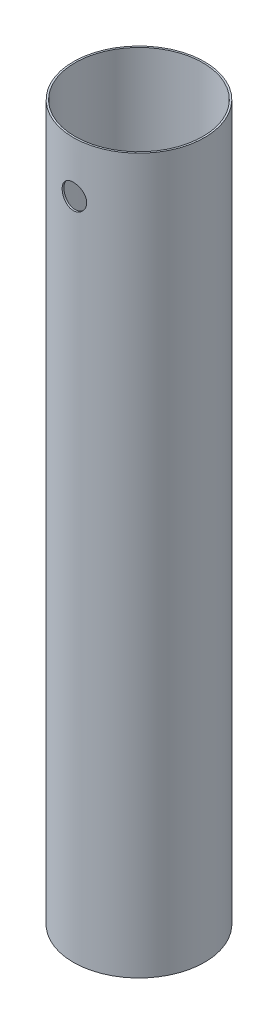
ISO-10303-21;
HEADER;
FILE_DESCRIPTION(('STEP AP214'),'2;1');
FILE_NAME('part.step','',(''),(''),'','','');
FILE_SCHEMA(('AUTOMOTIVE_DESIGN { 1 0 10303 214 1 1 1 1 }'));
ENDSEC;
DATA;
#1=APPLICATION_CONTEXT('core data for automotive mechanical design processes');
#2=APPLICATION_PROTOCOL_DEFINITION('international standard','automotive_design',2000,#1);
#3=PRODUCT_CONTEXT('',#1,'mechanical');
#4=PRODUCT('Part','Part','',(#3));
#5=PRODUCT_RELATED_PRODUCT_CATEGORY('part','',(#4));
#6=PRODUCT_DEFINITION_FORMATION('','',#4);
#7=PRODUCT_DEFINITION_CONTEXT('part definition',#1,'design');
#8=PRODUCT_DEFINITION('design','',#6,#7);
#9=PRODUCT_DEFINITION_SHAPE('','',#8);
#10=(LENGTH_UNIT() NAMED_UNIT(*) SI_UNIT(.MILLI.,.METRE.));
#11=(NAMED_UNIT(*) PLANE_ANGLE_UNIT() SI_UNIT($,.RADIAN.));
#12=(NAMED_UNIT(*) SI_UNIT($,.STERADIAN.) SOLID_ANGLE_UNIT());
#13=UNCERTAINTY_MEASURE_WITH_UNIT(LENGTH_MEASURE(1.E-05),#10,'distance_accuracy_value','');
#14=(GEOMETRIC_REPRESENTATION_CONTEXT(3) GLOBAL_UNCERTAINTY_ASSIGNED_CONTEXT((#13)) GLOBAL_UNIT_ASSIGNED_CONTEXT((#10,
#11,#12)) REPRESENTATION_CONTEXT('',''));
#15=CARTESIAN_POINT('',(0.,0.,0.));
#16=DIRECTION('',(0.,0.,1.));
#17=DIRECTION('',(1.,0.,0.));
#18=AXIS2_PLACEMENT_3D('',#15,#16,#17);
#19=CARTESIAN_POINT('',(0.,620.,0.));
#20=DIRECTION('',(0.,1.,0.));
#21=DIRECTION('',(0.,0.,1.));
#22=AXIS2_PLACEMENT_3D('',#19,#20,#21);
#23=PLANE('',#22);
#24=CARTESIAN_POINT('',(0.,620.,0.));
#25=DIRECTION('',(0.,1.,0.));
#26=DIRECTION('',(0.,0.,1.));
#27=AXIS2_PLACEMENT_3D('',#24,#25,#26);
#28=CIRCLE('',#27,57.);
#29=CARTESIAN_POINT('',(0.,620.,57.));
#30=VERTEX_POINT('',#29);
#31=EDGE_CURVE('E10',#30,#30,#28,.T.);
#32=ORIENTED_EDGE('',*,*,#31,.T.);
#33=EDGE_LOOP('',(#32));
#34=FACE_BOUND('',#33,.T.);
#35=CARTESIAN_POINT('',(0.,620.,0.));
#36=DIRECTION('',(0.,1.,0.));
#37=DIRECTION('',(0.,0.,1.));
#38=AXIS2_PLACEMENT_3D('',#35,#36,#37);
#39=CIRCLE('',#38,55.5);
#40=CARTESIAN_POINT('',(0.,620.,55.5));
#41=VERTEX_POINT('',#40);
#42=EDGE_CURVE('E62',#41,#41,#39,.T.);
#43=ORIENTED_EDGE('',*,*,#42,.F.);
#44=EDGE_LOOP('',(#43));
#45=FACE_BOUND('',#44,.T.);
#46=ADVANCED_FACE('F40',(#34,#45),#23,.T.);
#47=CARTESIAN_POINT('',(0.,0.,0.));
#48=DIRECTION('',(0.,1.,0.));
#49=DIRECTION('',(0.,0.,1.));
#50=AXIS2_PLACEMENT_3D('',#47,#48,#49);
#51=PLANE('',#50);
#52=CARTESIAN_POINT('',(0.,0.,0.));
#53=DIRECTION('',(0.,1.,0.));
#54=DIRECTION('',(0.,0.,1.));
#55=AXIS2_PLACEMENT_3D('',#52,#53,#54);
#56=CIRCLE('',#55,57.);
#57=CARTESIAN_POINT('',(0.,0.,57.));
#58=VERTEX_POINT('',#57);
#59=EDGE_CURVE('E55',#58,#58,#56,.T.);
#60=ORIENTED_EDGE('',*,*,#59,.F.);
#61=EDGE_LOOP('',(#60));
#62=FACE_BOUND('',#61,.T.);
#63=CARTESIAN_POINT('',(0.,0.,0.));
#64=DIRECTION('',(0.,1.,0.));
#65=DIRECTION('',(0.,0.,1.));
#66=AXIS2_PLACEMENT_3D('',#63,#64,#65);
#67=CIRCLE('',#66,55.5);
#68=CARTESIAN_POINT('',(0.,0.,55.5));
#69=VERTEX_POINT('',#68);
#70=EDGE_CURVE('E64',#69,#69,#67,.T.);
#71=ORIENTED_EDGE('',*,*,#70,.T.);
#72=EDGE_LOOP('',(#71));
#73=FACE_BOUND('',#72,.T.);
#74=ADVANCED_FACE('F88',(#62,#73),#51,.F.);
#75=CARTESIAN_POINT('',(0.,620.,0.));
#76=DIRECTION('',(0.,-1.,0.));
#77=DIRECTION('',(0.,0.,-1.));
#78=AXIS2_PLACEMENT_3D('',#75,#76,#77);
#79=CYLINDRICAL_SURFACE('',#78,57.);
#80=CARTESIAN_POINT('',(10.65,575.741472633223,55.9962275515056));
#81=CARTESIAN_POINT('',(10.65000534172,575.445079126248,55.9962248264401));
#82=CARTESIAN_POINT('',(10.6376233888147,575.148754530387,55.9985852715017));
#83=CARTESIAN_POINT('',(10.5882026044158,574.558152760593,56.0079516401063));
#84=CARTESIAN_POINT('',(10.5511593048583,574.263875967439,56.0149584054538));
#85=CARTESIAN_POINT('',(10.4526615865703,573.679364786281,56.0334218056581));
#86=CARTESIAN_POINT('',(10.391189061291,573.389133562315,56.0448817409927));
#87=CARTESIAN_POINT('',(10.2443130162571,572.814980961688,56.0719147438818));
#88=CARTESIAN_POINT('',(10.1589090370958,572.53105970627,56.0874878903964));
#89=CARTESIAN_POINT('',(9.96491503754014,571.971792101854,56.1222786392683));
#90=CARTESIAN_POINT('',(9.85634731284517,571.696437796917,56.1414927351434));
#91=CARTESIAN_POINT('',(9.61678197248006,571.155908658494,56.1830247836914));
#92=CARTESIAN_POINT('',(9.48578413368781,570.890733926299,56.2053427672397));
#93=CARTESIAN_POINT('',(9.2023417520133,570.372429009502,56.2524446506903));
#94=CARTESIAN_POINT('',(9.04990284532539,570.119295682912,56.2772279020502));
#95=CARTESIAN_POINT('',(8.72456958696248,569.62660865473,56.3285806948245));
#96=CARTESIAN_POINT('',(8.55166852101489,569.387059448863,56.3551508213267));
#97=CARTESIAN_POINT('',(8.18464126726326,568.920683920551,56.4096306419738));
#98=CARTESIAN_POINT('',(7.99030395204354,568.694025063332,56.4375517943655));
#99=CARTESIAN_POINT('',(7.58331246752891,568.257833815096,56.4936771532857));
#100=CARTESIAN_POINT('',(7.37065818987178,568.048301525412,56.5218813614878));
#101=CARTESIAN_POINT('',(6.92842489974236,567.647743386594,56.5777924796539));
#102=CARTESIAN_POINT('',(6.69884182060161,567.456722009857,56.6054992681262));
#103=CARTESIAN_POINT('',(6.22443471302235,567.094627831281,56.6596274198989));
#104=CARTESIAN_POINT('',(5.97961605242519,566.923548063913,56.6860492301467));
#105=CARTESIAN_POINT('',(5.47437068115221,566.601218195807,56.7370797671978));
#106=CARTESIAN_POINT('',(5.21383756098579,566.450132338925,56.7616728271243));
#107=CARTESIAN_POINT('',(4.6807172262186,566.17047517307,56.8081197480287));
#108=CARTESIAN_POINT('',(4.40812993167059,566.041904013451,56.8299735908356));
#109=CARTESIAN_POINT('',(3.85284324356498,565.808254334186,56.8703180635001));
#110=CARTESIAN_POINT('',(3.57014448991848,565.703174330925,56.8888089057385));
#111=CARTESIAN_POINT('',(2.99664766697983,565.517312033202,56.9218990297129));
#112=CARTESIAN_POINT('',(2.70584970059398,565.436529430177,56.9364983608684));
#113=CARTESIAN_POINT('',(2.1216640938384,565.300690429458,56.9612413977656));
#114=CARTESIAN_POINT('',(1.82834506923625,565.245347896734,56.9714345793777));
#115=CARTESIAN_POINT('',(1.23797717786894,565.159464912662,56.987319660378));
#116=CARTESIAN_POINT('',(0.94092833694922,565.128924289546,56.9930115909398));
#117=CARTESIAN_POINT('',(0.345284772764413,565.092890813221,56.9997322826956));
#118=CARTESIAN_POINT('',(0.0466901659414423,565.087396100025,57.0007613901651));
#119=CARTESIAN_POINT('',(-0.54988429000451,565.101493759488,56.998128059134));
#120=CARTESIAN_POINT('',(-0.847864143276523,565.121085962274,56.9944656524013));
#121=CARTESIAN_POINT('',(-1.43733760900371,565.184799388197,56.9826279514622));
#122=CARTESIAN_POINT('',(-1.72886578114958,565.228612017434,56.9745094418128));
#123=CARTESIAN_POINT('',(-2.30714178236026,565.34020780836,56.9540236082853));
#124=CARTESIAN_POINT('',(-2.59388965767292,565.407990738002,56.9416563255379));
#125=CARTESIAN_POINT('',(-3.16061087613501,565.567011589011,56.9130129842769));
#126=CARTESIAN_POINT('',(-3.44058405696084,565.658250071772,56.8967368322076));
#127=CARTESIAN_POINT('',(-3.99182397834184,565.863500070213,56.8607214322822));
#128=CARTESIAN_POINT('',(-4.26309064416641,565.977511781302,56.8409821547105));
#129=CARTESIAN_POINT('',(-4.79656722953721,566.228177406567,56.7984590685419));
#130=CARTESIAN_POINT('',(-5.05871798494011,566.364954434683,56.775658843734));
#131=CARTESIAN_POINT('',(-5.5705855009684,566.659716063939,56.7277239578587));
#132=CARTESIAN_POINT('',(-5.82030223400807,566.817700712126,56.7025892916126));
#133=CARTESIAN_POINT('',(-6.30565444237436,567.153786171784,56.6506690416864));
#134=CARTESIAN_POINT('',(-6.54128887233178,567.331888473817,56.6238833357441));
#135=CARTESIAN_POINT('',(-6.99690126508523,567.706987715805,56.5693912339517));
#136=CARTESIAN_POINT('',(-7.21687872216398,567.903985265592,56.5416848084049));
#137=CARTESIAN_POINT('',(-7.64293505402244,568.318686259561,56.4856833172036));
#138=CARTESIAN_POINT('',(-7.84875119040485,568.536659387901,56.4573857136243));
#139=CARTESIAN_POINT('',(-8.24132023264222,568.989223092942,56.4014181148873));
#140=CARTESIAN_POINT('',(-8.42807293500374,569.223813846983,56.3737481264316));
#141=CARTESIAN_POINT('',(-8.7812149030776,569.708019432623,56.3198205113734));
#142=CARTESIAN_POINT('',(-8.94760348616328,569.957634767445,56.2935629321329));
#143=CARTESIAN_POINT('',(-9.25881669197844,570.470163991736,56.2432144533586));
#144=CARTESIAN_POINT('',(-9.40364198480268,570.733077467616,56.219123486505));
#145=CARTESIAN_POINT('',(-9.67090193171305,571.270850200269,56.173766744464));
#146=CARTESIAN_POINT('',(-9.79329790042524,571.545729102942,56.1525058674825));
#147=CARTESIAN_POINT('',(-10.0144677214029,572.105075902329,56.113483733433));
#148=CARTESIAN_POINT('',(-10.1132415061677,572.38954382644,56.0957224863652));
#149=CARTESIAN_POINT('',(-10.2863903541128,572.966002320806,56.0642303486975));
#150=CARTESIAN_POINT('',(-10.3607676641251,573.257992195643,56.050499086962));
#151=CARTESIAN_POINT('',(-10.4845423458435,573.84739089667,56.0274784581005));
#152=CARTESIAN_POINT('',(-10.5339400647457,574.144799647483,56.0181890292367));
#153=CARTESIAN_POINT('',(-10.6068059116575,574.7383610421,56.0044375239406));
#154=CARTESIAN_POINT('',(-10.6306512654689,575.034465799615,55.999905239643));
#155=CARTESIAN_POINT('',(-10.6535274765912,575.627665677911,55.9955577723866));
#156=CARTESIAN_POINT('',(-10.6525585802065,575.924760788834,55.9957425426067));
#157=CARTESIAN_POINT('',(-10.6258149937319,576.517777124523,56.0008235567523));
#158=CARTESIAN_POINT('',(-10.6000414500792,576.813698402908,56.0057195829299));
#159=CARTESIAN_POINT('',(-10.5238956321937,577.402245609271,56.0200778127929));
#160=CARTESIAN_POINT('',(-10.4735234006106,577.69487154296,56.0295400085615));
#161=CARTESIAN_POINT('',(-10.3490910621219,578.272349900358,56.0526562910639));
#162=CARTESIAN_POINT('',(-10.2752289753928,578.557246438237,56.0662752984393));
#163=CARTESIAN_POINT('',(-10.1042611393219,579.119759101103,56.0973390453684));
#164=CARTESIAN_POINT('',(-10.0071555566471,579.397375278279,56.11478375749));
#165=CARTESIAN_POINT('',(-9.79043285472257,579.943400038214,56.1530009963545));
#166=CARTESIAN_POINT('',(-9.67081831303119,580.211809671081,56.1737731420239));
#167=CARTESIAN_POINT('',(-9.4098879617403,580.737742594077,56.2180710819258));
#168=CARTESIAN_POINT('',(-9.26856451065551,580.99526201001,56.2415978450811));
#169=CARTESIAN_POINT('',(-8.96352489341095,581.500445258669,56.2910237307714));
#170=CARTESIAN_POINT('',(-8.79957393063139,581.747965000209,56.3169466380936));
#171=CARTESIAN_POINT('',(-8.45166935936348,582.228362712535,56.3702070439594));
#172=CARTESIAN_POINT('',(-8.26771551011869,582.461240507035,56.3975445595271));
#173=CARTESIAN_POINT('',(-7.88101797798315,582.910851843931,56.4528803704564));
#174=CARTESIAN_POINT('',(-7.67826963928172,583.127581361928,56.4808788282609));
#175=CARTESIAN_POINT('',(-7.25546317501644,583.543307288674,56.5367464531471));
#176=CARTESIAN_POINT('',(-7.03541092722907,583.742309670391,56.5646156607552));
#177=CARTESIAN_POINT('',(-6.57633650901643,584.123869329821,56.6198370741547));
#178=CARTESIAN_POINT('',(-6.33709889708311,584.306169247027,56.6471772745601));
#179=CARTESIAN_POINT('',(-5.84393593684692,584.649966637466,56.7001755413523));
#180=CARTESIAN_POINT('',(-5.59001044087041,584.811463901495,56.7258335908211));
#181=CARTESIAN_POINT('',(-5.06923548370906,585.11248123806,56.7747411937357));
#182=CARTESIAN_POINT('',(-4.80238635113512,585.252001869015,56.7979908083739));
#183=CARTESIAN_POINT('',(-4.25762760223067,585.508032056377,56.8414220164264));
#184=CARTESIAN_POINT('',(-3.97971808512589,585.624541819164,56.8616036373567));
#185=CARTESIAN_POINT('',(-3.41628859071298,585.833114652484,56.8982270917645));
#186=CARTESIAN_POINT('',(-3.13081595697332,585.925302258102,56.9146879119121));
#187=CARTESIAN_POINT('',(-2.55291798455562,586.08531137282,56.9435360707327));
#188=CARTESIAN_POINT('',(-2.26049265967162,586.153132930258,56.9559234174867));
#189=CARTESIAN_POINT('',(-1.67083648290182,586.263867155402,56.9762697993717));
#190=CARTESIAN_POINT('',(-1.3736060537277,586.30678200206,56.9842292218752));
#191=CARTESIAN_POINT('',(-0.776496752723874,586.367365635222,56.9954929129057));
#192=CARTESIAN_POINT('',(-0.47661791143038,586.385034712428,56.9987972350358));
#193=CARTESIAN_POINT('',(0.119004808087024,586.394908784541,57.0006419456707));
#194=CARTESIAN_POINT('',(0.414742179900756,586.387497120409,56.9992540516032));
#195=CARTESIAN_POINT('',(1.00451703453301,586.348111585763,56.9919109713155));
#196=CARTESIAN_POINT('',(1.2985545357556,586.316137981679,56.9859558346374));
#197=CARTESIAN_POINT('',(1.88282815983224,586.227880480224,56.969644309272));
#198=CARTESIAN_POINT('',(2.17306433631244,586.171596926181,56.9592879827422));
#199=CARTESIAN_POINT('',(2.7476889878021,586.035155585152,56.9344615679833));
#200=CARTESIAN_POINT('',(3.03207744206589,585.954997713484,56.9199914651625));
#201=CARTESIAN_POINT('',(3.59252715435197,585.77157900103,56.8873660041778));
#202=CARTESIAN_POINT('',(3.86860218739494,585.668359070012,56.8692171769252));
#203=CARTESIAN_POINT('',(4.41105646086682,585.439500276966,56.8297153275995));
#204=CARTESIAN_POINT('',(4.67743572852071,585.313861477893,56.8083623145245));
#205=CARTESIAN_POINT('',(5.19865977359339,585.041093157875,56.7630369801119));
#206=CARTESIAN_POINT('',(5.45350651807215,584.89396732013,56.7390651078631));
#207=CARTESIAN_POINT('',(5.95013181284826,584.579170631138,56.6891369974426));
#208=CARTESIAN_POINT('',(6.19190441810828,584.411490544868,56.6631798692796));
#209=CARTESIAN_POINT('',(6.66400067500539,584.054261369865,56.6096134914309));
#210=CARTESIAN_POINT('',(6.89411267734322,583.864435250621,56.5819859994848));
#211=CARTESIAN_POINT('',(7.33748142591771,583.46627734418,56.5261999521916));
#212=CARTESIAN_POINT('',(7.55074510026051,583.257953239073,56.49804162109));
#213=CARTESIAN_POINT('',(7.95917089387464,582.824050417273,56.441953535108));
#214=CARTESIAN_POINT('',(8.15432485843819,582.598464010079,56.4140238883148));
#215=CARTESIAN_POINT('',(8.52508219857274,582.13164624464,56.3591882687725));
#216=CARTESIAN_POINT('',(8.70068573772316,581.890415017322,56.3322822874597));
#217=CARTESIAN_POINT('',(9.03264177312717,581.391644743982,56.2800132135823));
#218=CARTESIAN_POINT('',(9.18880190974307,581.133975879647,56.2546666279966));
#219=CARTESIAN_POINT('',(9.47881990829334,580.606156898911,56.2065262150289));
#220=CARTESIAN_POINT('',(9.6126781360195,580.336006987315,56.1837323457797));
#221=CARTESIAN_POINT('',(9.85699329812433,579.785334793562,56.1413845881468));
#222=CARTESIAN_POINT('',(9.96746944350674,579.504821250635,56.1218280428395));
#223=CARTESIAN_POINT('',(10.1642834314573,578.935316421252,56.0865162377999));
#224=CARTESIAN_POINT('',(10.250626161718,578.646326864545,56.0707602084453));
#225=CARTESIAN_POINT('',(10.4323984888836,577.927928904948,56.0372851337831));
#226=CARTESIAN_POINT('',(10.513893475836,577.494801290736,56.0219693670987));
#227=CARTESIAN_POINT('',(10.6226895383927,576.621555922881,56.0014427343131));
#228=CARTESIAN_POINT('',(10.6499920707652,576.181438357459,55.9962315965856));
#229=CARTESIAN_POINT('',(10.65,575.741472633223,55.9962275515056));
#230=B_SPLINE_CURVE_WITH_KNOTS('',3,(#80,#81,#82,#83,#84,#85,#86,#87,#88,#89,#90,#91,#92,#93,
#94,#95,#96,#97,#98,#99,#100,#101,#102,#103,#104,#105,#106,#107,#108,#109,#110,#111,#112,#113,
#114,#115,#116,#117,#118,#119,#120,#121,#122,#123,#124,#125,#126,#127,#128,#129,#130,#131,#132,
#133,#134,#135,#136,#137,#138,#139,#140,#141,#142,#143,#144,#145,#146,#147,#148,#149,#150,#151,
#152,#153,#154,#155,#156,#157,#158,#159,#160,#161,#162,#163,#164,#165,#166,#167,#168,#169,#170,
#171,#172,#173,#174,#175,#176,#177,#178,#179,#180,#181,#182,#183,#184,#185,#186,#187,#188,#189,
#190,#191,#192,#193,#194,#195,#196,#197,#198,#199,#200,#201,#202,#203,#204,#205,#206,#207,#208,
#209,#210,#211,#212,#213,#214,#215,#216,#217,#218,#219,#220,#221,#222,#223,#224,#225,#226,#227,
#228,#229),.UNSPECIFIED.,.T.,.F.,(4,2,2,2,2,2,2,2,2,2,2,2,2,2,2,2,2,2,2,2,2,2,2,2,2,2,2,2,2,2,2,
2,2,2,2,2,2,2,2,2,2,2,2,2,2,2,2,2,2,2,2,2,2,2,2,2,2,2,2,2,2,2,2,2,2,2,2,2,2,2,2,2,2,2,4),(0.,
0.888794156302971,1.7777493853298,2.66736472620557,3.55699714599681,4.44577710395667,
5.33456590351144,6.22312150308239,7.11196947810092,8.01052198767644,8.90907981340892,
9.80785420004695,10.7063137013962,11.6117477909775,12.5171878865972,13.4225707818128,
14.3279421787339,15.2228651128496,16.1177818490925,17.0126321249878,17.9074763415635,
18.7911736398097,19.6748623836009,20.5585722799012,21.4422897593175,22.3309516314112,
23.2196154749737,24.1083452048378,24.9971036274912,25.8993995054321,26.8017050139616,
27.7040407604391,28.6063484603279,29.5101980772732,30.414050276948,31.3178192115338,
32.2215755841166,33.1117979223394,34.002011424281,34.8921837837326,35.7823545997924,
36.6652117603227,37.548062590535,38.4308123846983,39.3138736197728,40.2069044567523,
41.0999460435165,41.9932094506552,42.8861707347928,43.7911494686404,44.6961373028276,
45.6011021378467,46.5060588560085,47.4062878801824,48.3065151184629,49.2066635888625,
50.1068016940545,50.9932443686917,51.879677428,52.7660979686998,53.6525216535667,
54.5373852234341,55.4222463084803,56.3069558927311,57.1920644441269,58.0897571489466,
58.9870787761892,59.8848025216537,60.7825187552528,61.6885094274869,62.5944852383666,
63.4997137738184,64.4047588420723,65.724117962855,67.043441616959),.UNSPECIFIED.);
#231=CARTESIAN_POINT('',(10.65,575.741472633223,55.9962275515056));
#232=VERTEX_POINT('',#231);
#233=EDGE_CURVE('E68',#232,#232,#230,.T.);
#234=ORIENTED_EDGE('',*,*,#233,.T.);
#235=EDGE_LOOP('',(#234));
#236=FACE_BOUND('',#235,.T.);
#237=ORIENTED_EDGE('',*,*,#31,.F.);
#238=EDGE_LOOP('',(#237));
#239=FACE_BOUND('',#238,.T.);
#240=ORIENTED_EDGE('',*,*,#59,.T.);
#241=EDGE_LOOP('',(#240));
#242=FACE_BOUND('',#241,.T.);
#243=ADVANCED_FACE('F42',(#236,#239,#242),#79,.T.);
#244=CARTESIAN_POINT('',(0.,620.,0.));
#245=DIRECTION('',(0.,-1.,0.));
#246=DIRECTION('',(0.,0.,-1.));
#247=AXIS2_PLACEMENT_3D('',#244,#245,#246);
#248=CYLINDRICAL_SURFACE('',#247,55.5);
#249=CARTESIAN_POINT('',(10.65,575.741472633223,54.4685918672403));
#250=CARTESIAN_POINT('',(10.6500055550788,575.445234532384,54.468588959538));
#251=CARTESIAN_POINT('',(10.6376364635373,575.149067215451,54.4710131380417));
#252=CARTESIAN_POINT('',(10.588268254093,574.558781179561,54.4806319571317));
#253=CARTESIAN_POINT('',(10.5512647852047,574.264662831773,54.487827440437));
#254=CARTESIAN_POINT('',(10.4528757100879,573.680474903363,54.5067874817091));
#255=CARTESIAN_POINT('',(10.3914724462182,573.390408412699,54.5185553484806));
#256=CARTESIAN_POINT('',(10.2447657276484,572.816584424915,54.5463137618559));
#257=CARTESIAN_POINT('',(10.1594618048777,572.53282705147,54.562304391158));
#258=CARTESIAN_POINT('',(9.96570275789061,571.973890624142,54.598026092729));
#259=CARTESIAN_POINT('',(9.85727049563187,571.698703404431,54.6177534691488));
#260=CARTESIAN_POINT('',(9.61801056121865,571.158499705151,54.6603936040822));
#261=CARTESIAN_POINT('',(9.4871826734927,570.893483323512,54.683306393257));
#262=CARTESIAN_POINT('',(9.20411297506307,570.375478049101,54.731662724475));
#263=CARTESIAN_POINT('',(9.05187661699264,570.122486115644,54.7571056216304));
#264=CARTESIAN_POINT('',(8.72698003953598,569.63006035122,54.8098248637525));
#265=CARTESIAN_POINT('',(8.55431311172929,569.390631011933,54.8371018096566));
#266=CARTESIAN_POINT('',(8.18767402451638,568.924327383007,54.8930484270366));
#267=CARTESIAN_POINT('',(7.99347928675951,568.697629561527,54.9217305252808));
#268=CARTESIAN_POINT('',(7.58677418649698,568.261345803095,54.9793873112533));
#269=CARTESIAN_POINT('',(7.37426370962917,568.051759973005,55.0083620008075));
#270=CARTESIAN_POINT('',(6.93231429758465,567.651076747292,55.0658031147716));
#271=CARTESIAN_POINT('',(6.70287126540526,567.459983852242,55.0942694140883));
#272=CARTESIAN_POINT('',(6.22873557032989,567.097727452547,55.1498848285052));
#273=CARTESIAN_POINT('',(5.98404827905553,566.926556988132,55.1770344016498));
#274=CARTESIAN_POINT('',(5.47894370553983,566.603956111591,55.2294863243884));
#275=CARTESIAN_POINT('',(5.21841394102741,566.452698979499,55.2547717111656));
#276=CARTESIAN_POINT('',(4.68527184949094,566.172701171989,55.3025302085309));
#277=CARTESIAN_POINT('',(4.41265943780919,566.043960654366,55.3250032994104));
#278=CARTESIAN_POINT('',(3.85729431251488,565.809978907027,55.3664953129545));
#279=CARTESIAN_POINT('',(3.57454227576461,565.704736112115,55.3855144656719));
#280=CARTESIAN_POINT('',(3.00091110769921,565.518559285639,55.4195549707147));
#281=CARTESIAN_POINT('',(2.71003208546462,565.437624927977,55.4345763766696));
#282=CARTESIAN_POINT('',(2.12584190625735,565.301542086631,55.4600327599571));
#283=CARTESIAN_POINT('',(1.83260329765702,565.246092107811,55.4705212705093));
#284=CARTESIAN_POINT('',(1.24238056773979,565.159982560096,55.4868780962192));
#285=CARTESIAN_POINT('',(0.945396473771501,565.129322810295,55.4927464450924));
#286=CARTESIAN_POINT('',(0.349870137147698,565.093041927691,55.4996960201972));
#287=CARTESIAN_POINT('',(0.0513280180046984,565.087418839408,55.500777620296));
#288=CARTESIAN_POINT('',(-0.545151910713216,565.101251657443,55.4981238966245));
#289=CARTESIAN_POINT('',(-0.843089724595897,565.120707384354,55.494388607313));
#290=CARTESIAN_POINT('',(-1.43228557929927,565.184119870973,55.4822876907486));
#291=CARTESIAN_POINT('',(-1.72357995500921,565.227751425754,55.4739835325693));
#292=CARTESIAN_POINT('',(-2.30140163396727,565.33894362206,55.453017342819));
#293=CARTESIAN_POINT('',(-2.58792898586119,565.406504019241,55.4403553557467));
#294=CARTESIAN_POINT('',(-3.15422597519841,565.565038164923,55.4110210743362));
#295=CARTESIAN_POINT('',(-3.43399544495457,565.656012493754,55.3943486805979));
#296=CARTESIAN_POINT('',(-3.98484910635754,565.860692627799,55.3574492529971));
#297=CARTESIAN_POINT('',(-4.25593321979958,565.974398637626,55.3372221871383));
#298=CARTESIAN_POINT('',(-4.7891409787258,566.224443442328,55.2936353313748));
#299=CARTESIAN_POINT('',(-5.05120281022606,566.36091095495,55.2702578790786));
#300=CARTESIAN_POINT('',(-5.56291944593526,566.65502565467,55.2211010985885));
#301=CARTESIAN_POINT('',(-5.81257422149645,566.812672890668,55.1953217648491));
#302=CARTESIAN_POINT('',(-6.29783675460184,567.148059445018,55.1420605952547));
#303=CARTESIAN_POINT('',(-6.53344340732037,567.325800340475,55.1145786258403));
#304=CARTESIAN_POINT('',(-6.9890396815616,567.700157014718,55.0586597359243));
#305=CARTESIAN_POINT('',(-7.20902878885488,567.896773414503,55.0302227840239));
#306=CARTESIAN_POINT('',(-7.63532945127862,568.310863319101,54.9727091792122));
#307=CARTESIAN_POINT('',(-7.84136459057261,568.528621086801,54.9436295874479));
#308=CARTESIAN_POINT('',(-8.23439086450794,568.980774646743,54.8861026645687));
#309=CARTESIAN_POINT('',(-8.42138178501779,569.215170626014,54.8576553405658));
#310=CARTESIAN_POINT('',(-8.77501980196838,569.69901286931,54.8021995411011));
#311=CARTESIAN_POINT('',(-8.94166617599396,569.948459667305,54.7751911167525));
#312=CARTESIAN_POINT('',(-9.2534124574828,570.460682570292,54.7233893011517));
#313=CARTESIAN_POINT('',(-9.3985130447475,570.723458254385,54.6985958400239));
#314=CARTESIAN_POINT('',(-9.66636104815907,571.261035762929,54.6518983332128));
#315=CARTESIAN_POINT('',(-9.78906597592121,571.535859244427,54.6299998009536));
#316=CARTESIAN_POINT('',(-10.0108553084363,572.095136128315,54.5897928976933));
#317=CARTESIAN_POINT('',(-10.1099396408245,572.379589560206,54.5714845376912));
#318=CARTESIAN_POINT('',(-10.2837047117199,572.956057924044,54.5390065711856));
#319=CARTESIAN_POINT('',(-10.3583878309766,573.24807211531,54.5248365609306));
#320=CARTESIAN_POINT('',(-10.4827640050467,573.837556907343,54.501061234736));
#321=CARTESIAN_POINT('',(-10.5324574277463,574.135027427718,54.4914558515981));
#322=CARTESIAN_POINT('',(-10.6058652138129,574.728502169305,54.4772154088063));
#323=CARTESIAN_POINT('',(-10.6299772182898,575.024455434758,54.4725042967202));
#324=CARTESIAN_POINT('',(-10.6534090436902,575.617377934607,54.4679265323629));
#325=CARTESIAN_POINT('',(-10.6527291239759,575.914347158342,54.4680598294117));
#326=CARTESIAN_POINT('',(-10.6265835625619,576.507135048584,54.4731667635946));
#327=CARTESIAN_POINT('',(-10.6011191310609,576.80295377056,54.4781401643921));
#328=CARTESIAN_POINT('',(-10.525610520068,577.391318523028,54.4927793244861));
#329=CARTESIAN_POINT('',(-10.4755663867962,577.683864559672,54.5024450749589));
#330=CARTESIAN_POINT('',(-10.3518384477375,578.261054991217,54.5260796711548));
#331=CARTESIAN_POINT('',(-10.2783649601904,578.545746086463,54.5400101905063));
#332=CARTESIAN_POINT('',(-10.1082167828359,579.107878626762,54.5718007413864));
#333=CARTESIAN_POINT('',(-10.011542269543,579.385320126952,54.5896607430192));
#334=CARTESIAN_POINT('',(-9.79572241801046,579.931032163172,54.628800453052));
#335=CARTESIAN_POINT('',(-9.67657959042189,580.199303719917,54.6500797793311));
#336=CARTESIAN_POINT('',(-9.41663133922515,580.725002487,54.6954701822503));
#337=CARTESIAN_POINT('',(-9.27581828230587,580.982425835211,54.7195822560113));
#338=CARTESIAN_POINT('',(-8.97175044070642,581.487614033834,54.7702631122516));
#339=CARTESIAN_POINT('',(-8.80824888653048,581.73522778081,54.7968576808732));
#340=CARTESIAN_POINT('',(-8.46124981587441,582.215853455688,54.8515094505198));
#341=CARTESIAN_POINT('',(-8.27775204500572,582.448865197767,54.8795666701501));
#342=CARTESIAN_POINT('',(-7.89196719707576,582.898789933571,54.9363710610076));
#343=CARTESIAN_POINT('',(-7.6896753862605,583.115698846506,54.9651184047005));
#344=CARTESIAN_POINT('',(-7.26777584463047,583.531831896788,55.0224929553654));
#345=CARTESIAN_POINT('',(-7.04817398259007,583.731061979655,55.0511201996183));
#346=CARTESIAN_POINT('',(-6.58981431822529,584.113279707114,55.1078798201787));
#347=CARTESIAN_POINT('',(-6.35082827223724,584.295995671176,55.1359993452717));
#348=CARTESIAN_POINT('',(-5.85812368178425,584.640645255055,55.1905228159235));
#349=CARTESIAN_POINT('',(-5.60440498071351,584.802578653899,55.2169267432394));
#350=CARTESIAN_POINT('',(-5.08399457863754,585.104484362398,55.2672717421711));
#351=CARTESIAN_POINT('',(-4.81730321798445,585.244457247806,55.2912128783498));
#352=CARTESIAN_POINT('',(-4.27280759382826,585.501402788451,55.3359532492771));
#353=CARTESIAN_POINT('',(-3.99500343495246,585.618375660172,55.3567525135978));
#354=CARTESIAN_POINT('',(-3.43178776366148,585.827855287024,55.3945128287704));
#355=CARTESIAN_POINT('',(-3.14642572505072,585.920491389313,55.4114940993044));
#356=CARTESIAN_POINT('',(-2.56869867084036,586.081404950214,55.4412792225196));
#357=CARTESIAN_POINT('',(-2.27633366947211,586.149682458321,55.4540830836893));
#358=CARTESIAN_POINT('',(-1.6867509884248,586.261329130544,55.4751464278617));
#359=CARTESIAN_POINT('',(-1.38953376006852,586.304700597836,55.483406331062));
#360=CARTESIAN_POINT('',(-0.792405916650302,586.36619264021,55.4951462782028));
#361=CARTESIAN_POINT('',(-0.492495334489579,586.384313523326,55.4986263804522));
#362=CARTESIAN_POINT('',(0.102981188747217,586.39507045539,55.500690291755));
#363=CARTESIAN_POINT('',(0.398539637326604,586.388110708872,55.4993517592695));
#364=CARTESIAN_POINT('',(0.987994719048512,586.349658068453,55.4919880942462));
#365=CARTESIAN_POINT('',(1.28189137115768,586.318165455125,55.4859630153066));
#366=CARTESIAN_POINT('',(1.86592110894092,586.230896600857,55.4693941181117));
#367=CARTESIAN_POINT('',(2.15605425244341,586.175120733498,55.4588503693731));
#368=CARTESIAN_POINT('',(2.73051170874714,586.039719600861,55.4335365339085));
#369=CARTESIAN_POINT('',(3.01483600027006,585.960094248235,55.418766431704));
#370=CARTESIAN_POINT('',(3.5751438051655,585.77778045499,55.3854400156589));
#371=CARTESIAN_POINT('',(3.85114252142823,585.675137353249,55.3668911514684));
#372=CARTESIAN_POINT('',(4.3934912835288,585.447462019677,55.3264962455318));
#373=CARTESIAN_POINT('',(4.65984135865931,585.322429855824,55.3046502137968));
#374=CARTESIAN_POINT('',(5.1810602427381,585.050900681288,55.2582579235033));
#375=CARTESIAN_POINT('',(5.43593096219213,584.904407259784,55.2337121166255));
#376=CARTESIAN_POINT('',(5.9326619480608,584.590897520631,55.1825688172359));
#377=CARTESIAN_POINT('',(6.17451629407841,584.423871975657,55.1559704042775));
#378=CARTESIAN_POINT('',(6.64701153357538,584.067848771752,55.1010404243668));
#379=CARTESIAN_POINT('',(6.87743087365642,583.878560091782,55.0726888988358));
#380=CARTESIAN_POINT('',(7.32146102492336,583.481458861776,55.015418855142));
#381=CARTESIAN_POINT('',(7.53507872836133,583.27365398273,54.9865005756149));
#382=CARTESIAN_POINT('',(7.94426139539366,582.840765213224,54.9288760982576));
#383=CARTESIAN_POINT('',(8.13981823129327,582.615673626103,54.9001700012076));
#384=CARTESIAN_POINT('',(8.5114309158086,582.149812882181,54.8437861050035));
#385=CARTESIAN_POINT('',(8.68748691728028,581.909043848292,54.8161082977903));
#386=CARTESIAN_POINT('',(9.02049897167618,581.411014419729,54.7622985108841));
#387=CARTESIAN_POINT('',(9.17725073792758,581.153615429445,54.7361843568844));
#388=CARTESIAN_POINT('',(9.4684716479837,580.626272912855,54.6865602473562));
#389=CARTESIAN_POINT('',(9.60294116211801,580.356329595132,54.663050248549));
#390=CARTESIAN_POINT('',(9.8484932611014,579.805999230748,54.6193440281716));
#391=CARTESIAN_POINT('',(9.95959472331258,579.525620831033,54.5991451347317));
#392=CARTESIAN_POINT('',(10.1576639237666,578.956317542357,54.5626426142231));
#393=CARTESIAN_POINT('',(10.2446364672684,578.667394367784,54.546338211659));
#394=CARTESIAN_POINT('',(10.4287976539109,577.945759294553,54.5114930182533));
#395=CARTESIAN_POINT('',(10.5116388266275,577.509177030071,54.4954912041114));
#396=CARTESIAN_POINT('',(10.622235025394,576.628834338738,54.4740429618504));
#397=CARTESIAN_POINT('',(10.649991681552,576.185074124696,54.4685962213767));
#398=CARTESIAN_POINT('',(10.65,575.741472633223,54.4685918672403));
#399=B_SPLINE_CURVE_WITH_KNOTS('',3,(#249,#250,#251,#252,#253,#254,#255,#256,#257,#258,#259,
#260,#261,#262,#263,#264,#265,#266,#267,#268,#269,#270,#271,#272,#273,#274,#275,#276,#277,#278,
#279,#280,#281,#282,#283,#284,#285,#286,#287,#288,#289,#290,#291,#292,#293,#294,#295,#296,#297,
#298,#299,#300,#301,#302,#303,#304,#305,#306,#307,#308,#309,#310,#311,#312,#313,#314,#315,#316,
#317,#318,#319,#320,#321,#322,#323,#324,#325,#326,#327,#328,#329,#330,#331,#332,#333,#334,#335,
#336,#337,#338,#339,#340,#341,#342,#343,#344,#345,#346,#347,#348,#349,#350,#351,#352,#353,#354,
#355,#356,#357,#358,#359,#360,#361,#362,#363,#364,#365,#366,#367,#368,#369,#370,#371,#372,#373,
#374,#375,#376,#377,#378,#379,#380,#381,#382,#383,#384,#385,#386,#387,#388,#389,#390,#391,#392,
#393,#394,#395,#396,#397,#398),.UNSPECIFIED.,.T.,.F.,(4,2,2,2,2,2,2,2,2,2,2,2,2,2,2,2,2,2,2,2,2,
2,2,2,2,2,2,2,2,2,2,2,2,2,2,2,2,2,2,2,2,2,2,2,2,2,2,2,2,2,2,2,2,2,2,2,2,2,2,2,2,2,2,2,2,2,2,2,2,
2,2,2,2,2,4),(0.,0.888324599500782,1.77680613876047,2.66593182865144,3.55507493239971,
4.44334317350197,5.33161996520465,6.2196709255083,7.10801429264324,8.00659428652012,
8.9051798914714,9.80398363566976,10.702472440204,11.6083249516159,12.5141838109346,
13.4199823125493,14.3257686623549,15.2205442129273,16.1153132338467,17.0100123679451,
17.9047051016399,18.7876450733299,19.6705760293958,20.5535288716681,21.4364896620019,
22.3246243640806,23.2127611167582,24.1009676257698,24.9892033666661,25.8917047715877,
26.7942163230352,27.6967599124793,28.5992750192843,29.5034849460541,30.4076976429548,
31.3118220923081,32.2159332311842,33.1057750653841,33.9956075904536,34.8853966682179,
35.7751840728074,36.6571989186595,37.5392070543174,38.4211166910909,39.3033376935025,
40.1960411139541,41.0887558925573,41.9816961367097,42.8743349312034,43.779684446365,
44.6850435870118,45.5903789873544,46.4957058659457,47.3961189630894,48.2965302305762,
49.1968582194721,50.0971752251457,50.9830478936506,51.8689104308971,52.7547593402067,
53.6406114938732,54.5247338450371,55.4088535118362,56.2928254869949,57.1771961897139,
58.0747813884949,58.9719964445801,59.8696133149856,60.7672231489847,61.6736374702373,
62.5800367254308,63.4857009297197,64.3911846418695,65.7214449226246,67.051665836594),.UNSPECIFIED.);
#400=CARTESIAN_POINT('',(10.65,575.741472633223,54.4685918672403));
#401=VERTEX_POINT('',#400);
#402=EDGE_CURVE('E45',#401,#401,#399,.T.);
#403=ORIENTED_EDGE('',*,*,#402,.F.);
#404=EDGE_LOOP('',(#403));
#405=FACE_BOUND('',#404,.T.);
#406=ORIENTED_EDGE('',*,*,#42,.T.);
#407=EDGE_LOOP('',(#406));
#408=FACE_BOUND('',#407,.T.);
#409=ORIENTED_EDGE('',*,*,#70,.F.);
#410=EDGE_LOOP('',(#409));
#411=FACE_BOUND('',#410,.T.);
#412=ADVANCED_FACE('F80',(#405,#408,#411),#248,.F.);
#413=CARTESIAN_POINT('',(0.,575.741472633223,47.));
#414=DIRECTION('',(0.,0.,1.));
#415=DIRECTION('',(1.,0.,0.));
#416=AXIS2_PLACEMENT_3D('',#413,#414,#415);
#417=CYLINDRICAL_SURFACE('',#416,10.65);
#418=ORIENTED_EDGE('',*,*,#402,.T.);
#419=EDGE_LOOP('',(#418));
#420=FACE_BOUND('',#419,.T.);
#421=ORIENTED_EDGE('',*,*,#233,.F.);
#422=EDGE_LOOP('',(#421));
#423=FACE_BOUND('',#422,.T.);
#424=ADVANCED_FACE('F77',(#420,#423),#417,.F.);
#425=CLOSED_SHELL('',(#46,#74,#243,#412,#424));
#426=MANIFOLD_SOLID_BREP('B2',#425);
#427=ADVANCED_BREP_SHAPE_REPRESENTATION('',(#18,#426),#14);
#428=SHAPE_DEFINITION_REPRESENTATION(#9,#427);
ENDSEC;
END-ISO-10303-21;
